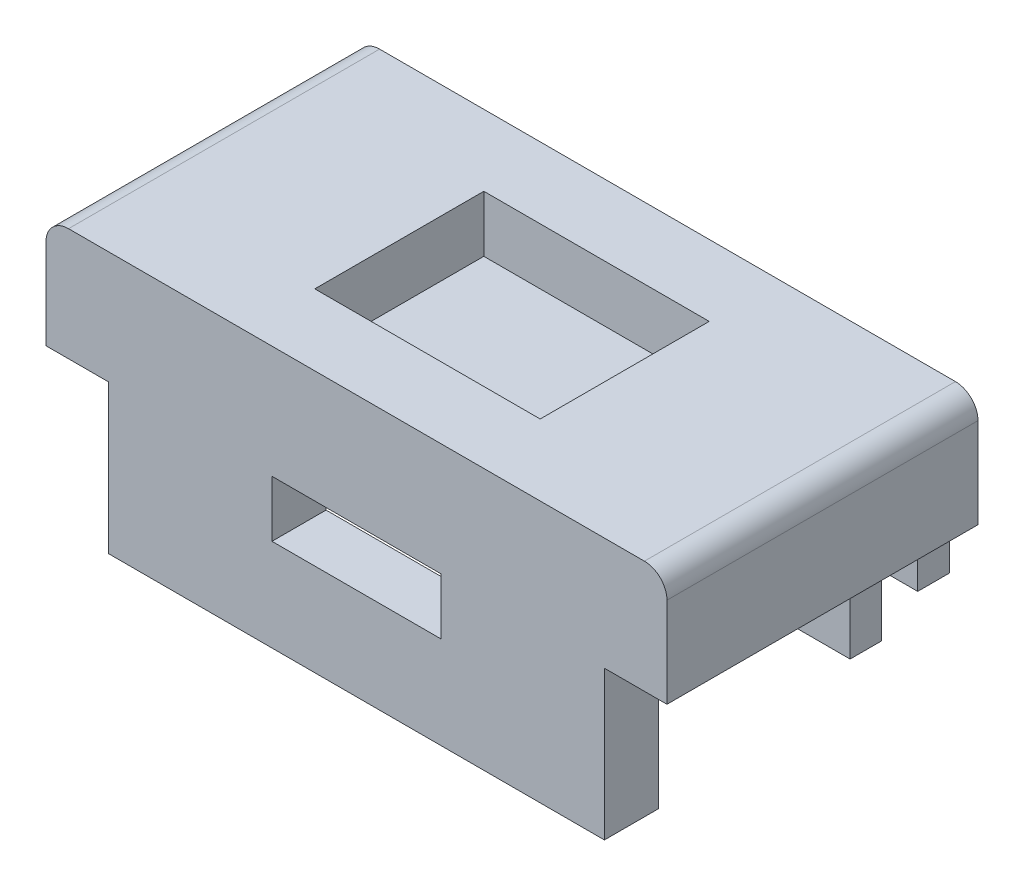
ISO-10303-21;
HEADER;
FILE_DESCRIPTION(('STEP AP214'),'2;1');
FILE_NAME('part.step','',(''),(''),'','','');
FILE_SCHEMA(('AUTOMOTIVE_DESIGN { 1 0 10303 214 1 1 1 1 }'));
ENDSEC;
DATA;
#1=APPLICATION_CONTEXT('core data for automotive mechanical design processes');
#2=APPLICATION_PROTOCOL_DEFINITION('international standard','automotive_design',2000,#1);
#3=PRODUCT_CONTEXT('',#1,'mechanical');
#4=PRODUCT('Part','Part','',(#3));
#5=PRODUCT_RELATED_PRODUCT_CATEGORY('part','',(#4));
#6=PRODUCT_DEFINITION_FORMATION('','',#4);
#7=PRODUCT_DEFINITION_CONTEXT('part definition',#1,'design');
#8=PRODUCT_DEFINITION('design','',#6,#7);
#9=PRODUCT_DEFINITION_SHAPE('','',#8);
#10=(LENGTH_UNIT() NAMED_UNIT(*) SI_UNIT(.MILLI.,.METRE.));
#11=(NAMED_UNIT(*) PLANE_ANGLE_UNIT() SI_UNIT($,.RADIAN.));
#12=(NAMED_UNIT(*) SI_UNIT($,.STERADIAN.) SOLID_ANGLE_UNIT());
#13=UNCERTAINTY_MEASURE_WITH_UNIT(LENGTH_MEASURE(1.E-05),#10,'distance_accuracy_value','');
#14=(GEOMETRIC_REPRESENTATION_CONTEXT(3) GLOBAL_UNCERTAINTY_ASSIGNED_CONTEXT((#13)) GLOBAL_UNIT_ASSIGNED_CONTEXT((#10,
#11,#12)) REPRESENTATION_CONTEXT('',''));
#15=CARTESIAN_POINT('',(0.,0.,0.));
#16=DIRECTION('',(0.,0.,1.));
#17=DIRECTION('',(1.,0.,0.));
#18=AXIS2_PLACEMENT_3D('',#15,#16,#17);
#19=CARTESIAN_POINT('',(0.,-3.81,0.));
#20=DIRECTION('',(0.,1.,0.));
#21=DIRECTION('',(1.,0.,0.));
#22=AXIS2_PLACEMENT_3D('',#19,#20,#21);
#23=PLANE('',#22);
#24=DIRECTION('',(0.,0.,-1.));
#25=VECTOR('',#24,1.);
#26=CARTESIAN_POINT('',(6.35,-3.81,-7.62));
#27=LINE('',#26,#25);
#28=CARTESIAN_POINT('',(6.35,-3.81,-2.794));
#29=VERTEX_POINT('',#28);
#30=CARTESIAN_POINT('',(6.35,-3.81,-3.5052));
#31=VERTEX_POINT('',#30);
#32=EDGE_CURVE('E172',#29,#31,#27,.T.);
#33=ORIENTED_EDGE('',*,*,#32,.F.);
#34=DIRECTION('',(-1.,0.,0.));
#35=VECTOR('',#34,1.);
#36=CARTESIAN_POINT('',(12.7,-3.81,-2.794));
#37=LINE('',#36,#35);
#38=CARTESIAN_POINT('',(4.826,-3.81,-2.794));
#39=VERTEX_POINT('',#38);
#40=EDGE_CURVE('E340',#29,#39,#37,.T.);
#41=ORIENTED_EDGE('',*,*,#40,.T.);
#42=DIRECTION('',(0.,0.,1.));
#43=VECTOR('',#42,1.);
#44=CARTESIAN_POINT('',(4.826,-3.81,-3.81));
#45=LINE('',#44,#43);
#46=CARTESIAN_POINT('',(4.826,-3.81,-3.5052));
#47=VERTEX_POINT('',#46);
#48=EDGE_CURVE('E26',#47,#39,#45,.T.);
#49=ORIENTED_EDGE('',*,*,#48,.F.);
#50=DIRECTION('',(-1.,0.,0.));
#51=VECTOR('',#50,1.);
#52=CARTESIAN_POINT('',(-6.4897,-3.81,-3.5052));
#53=LINE('',#52,#51);
#54=EDGE_CURVE('E363',#31,#47,#53,.T.);
#55=ORIENTED_EDGE('',*,*,#54,.F.);
#56=EDGE_LOOP('',(#33,#41,#49,#55));
#57=FACE_BOUND('',#56,.T.);
#58=ADVANCED_FACE('F16',(#57),#23,.F.);
#59=CARTESIAN_POINT('',(0.,-3.81,0.));
#60=DIRECTION('',(0.,1.,0.));
#61=DIRECTION('',(1.,0.,0.));
#62=AXIS2_PLACEMENT_3D('',#59,#60,#61);
#63=PLANE('',#62);
#64=DIRECTION('',(0.,0.,-1.));
#65=VECTOR('',#64,1.);
#66=CARTESIAN_POINT('',(-4.826,-3.81,-0.762));
#67=LINE('',#66,#65);
#68=CARTESIAN_POINT('',(-4.826,-3.81,-2.794));
#69=VERTEX_POINT('',#68);
#70=CARTESIAN_POINT('',(-4.826,-3.81,-3.5052));
#71=VERTEX_POINT('',#70);
#72=EDGE_CURVE('E11',#69,#71,#67,.T.);
#73=ORIENTED_EDGE('',*,*,#72,.F.);
#74=DIRECTION('',(-1.,0.,0.));
#75=VECTOR('',#74,1.);
#76=CARTESIAN_POINT('',(12.7,-3.81,-2.794));
#77=LINE('',#76,#75);
#78=CARTESIAN_POINT('',(-6.35,-3.81,-2.794));
#79=VERTEX_POINT('',#78);
#80=EDGE_CURVE('E321',#69,#79,#77,.T.);
#81=ORIENTED_EDGE('',*,*,#80,.T.);
#82=DIRECTION('',(0.,0.,1.));
#83=VECTOR('',#82,1.);
#84=CARTESIAN_POINT('',(-6.35,-3.81,-1.27));
#85=LINE('',#84,#83);
#86=CARTESIAN_POINT('',(-6.35,-3.81,-3.5052));
#87=VERTEX_POINT('',#86);
#88=EDGE_CURVE('E373',#87,#79,#85,.T.);
#89=ORIENTED_EDGE('',*,*,#88,.F.);
#90=DIRECTION('',(-1.,0.,0.));
#91=VECTOR('',#90,1.);
#92=CARTESIAN_POINT('',(-6.4897,-3.81,-3.5052));
#93=LINE('',#92,#91);
#94=EDGE_CURVE('E342',#71,#87,#93,.T.);
#95=ORIENTED_EDGE('',*,*,#94,.F.);
#96=EDGE_LOOP('',(#73,#81,#89,#95));
#97=FACE_BOUND('',#96,.T.);
#98=ADVANCED_FACE('F743',(#97),#63,.F.);
#99=CARTESIAN_POINT('',(-4.826,-16.51,-0.762));
#100=DIRECTION('',(1.,0.,0.));
#101=DIRECTION('',(0.,1.,0.));
#102=AXIS2_PLACEMENT_3D('',#99,#100,#101);
#103=PLANE('',#102);
#104=DIRECTION('',(0.,0.,-1.));
#105=VECTOR('',#104,1.);
#106=CARTESIAN_POINT('',(-4.826,-5.8928,3.5052));
#107=LINE('',#106,#105);
#108=CARTESIAN_POINT('',(-4.826,-5.8928,-2.794));
#109=VERTEX_POINT('',#108);
#110=CARTESIAN_POINT('',(-4.826,-5.8928,-3.5052));
#111=VERTEX_POINT('',#110);
#112=EDGE_CURVE('E437',#109,#111,#107,.T.);
#113=ORIENTED_EDGE('',*,*,#112,.F.);
#114=DIRECTION('',(0.,1.,0.));
#115=VECTOR('',#114,1.);
#116=CARTESIAN_POINT('',(-4.826,-8.4328,-2.794));
#117=LINE('',#116,#115);
#118=EDGE_CURVE('E325',#109,#69,#117,.T.);
#119=ORIENTED_EDGE('',*,*,#118,.T.);
#120=ORIENTED_EDGE('',*,*,#72,.T.);
#121=DIRECTION('',(0.,1.,0.));
#122=VECTOR('',#121,1.);
#123=CARTESIAN_POINT('',(-4.826,-0.508,-3.5052));
#124=LINE('',#123,#122);
#125=EDGE_CURVE('E347',#111,#71,#124,.T.);
#126=ORIENTED_EDGE('',*,*,#125,.F.);
#127=EDGE_LOOP('',(#113,#119,#120,#126));
#128=FACE_BOUND('',#127,.T.);
#129=ADVANCED_FACE('F748',(#128),#103,.F.);
#130=CARTESIAN_POINT('',(4.826,-16.51,-3.81));
#131=DIRECTION('',(-1.,0.,0.));
#132=DIRECTION('',(0.,0.,1.));
#133=AXIS2_PLACEMENT_3D('',#130,#131,#132);
#134=PLANE('',#133);
#135=ORIENTED_EDGE('',*,*,#48,.T.);
#136=DIRECTION('',(0.,-1.,0.));
#137=VECTOR('',#136,1.);
#138=CARTESIAN_POINT('',(4.826,-8.4328,-2.794));
#139=LINE('',#138,#137);
#140=CARTESIAN_POINT('',(4.826,-5.8928,-2.794));
#141=VERTEX_POINT('',#140);
#142=EDGE_CURVE('E336',#39,#141,#139,.T.);
#143=ORIENTED_EDGE('',*,*,#142,.T.);
#144=DIRECTION('',(0.,0.,1.));
#145=VECTOR('',#144,1.);
#146=CARTESIAN_POINT('',(4.826,-5.8928,3.5052));
#147=LINE('',#146,#145);
#148=CARTESIAN_POINT('',(4.826,-5.8928,-3.5052));
#149=VERTEX_POINT('',#148);
#150=EDGE_CURVE('E312',#149,#141,#147,.T.);
#151=ORIENTED_EDGE('',*,*,#150,.F.);
#152=DIRECTION('',(0.,-1.,0.));
#153=VECTOR('',#152,1.);
#154=CARTESIAN_POINT('',(4.826,-0.508,-3.5052));
#155=LINE('',#154,#153);
#156=EDGE_CURVE('E367',#47,#149,#155,.T.);
#157=ORIENTED_EDGE('',*,*,#156,.F.);
#158=EDGE_LOOP('',(#135,#143,#151,#157));
#159=FACE_BOUND('',#158,.T.);
#160=ADVANCED_FACE('F711',(#159),#134,.F.);
#161=CARTESIAN_POINT('',(2.54,0.,0.));
#162=DIRECTION('',(1.,0.,0.));
#163=DIRECTION('',(0.,1.,0.));
#164=AXIS2_PLACEMENT_3D('',#161,#162,#163);
#165=PLANE('',#164);
#166=DIRECTION('',(0.,-1.,0.));
#167=VECTOR('',#166,1.);
#168=CARTESIAN_POINT('',(2.54,0.,1.905));
#169=LINE('',#168,#167);
#170=CARTESIAN_POINT('',(2.54,0.,1.905));
#171=VERTEX_POINT('',#170);
#172=CARTESIAN_POINT('',(2.54,-1.27,1.905));
#173=VERTEX_POINT('',#172);
#174=EDGE_CURVE('E372',#171,#173,#169,.T.);
#175=ORIENTED_EDGE('',*,*,#174,.F.);
#176=DIRECTION('',(0.,0.,1.));
#177=VECTOR('',#176,1.);
#178=CARTESIAN_POINT('',(2.54,0.,-1.905));
#179=LINE('',#178,#177);
#180=CARTESIAN_POINT('',(2.54,0.,-1.905));
#181=VERTEX_POINT('',#180);
#182=EDGE_CURVE('E276',#181,#171,#179,.T.);
#183=ORIENTED_EDGE('',*,*,#182,.F.);
#184=DIRECTION('',(0.,1.,0.));
#185=VECTOR('',#184,1.);
#186=CARTESIAN_POINT('',(2.54,-1.27,-1.905));
#187=LINE('',#186,#185);
#188=CARTESIAN_POINT('',(2.54,-1.27,-1.905));
#189=VERTEX_POINT('',#188);
#190=EDGE_CURVE('E39',#189,#181,#187,.T.);
#191=ORIENTED_EDGE('',*,*,#190,.F.);
#192=DIRECTION('',(0.,0.,-1.));
#193=VECTOR('',#192,1.);
#194=CARTESIAN_POINT('',(2.54,-1.27,1.905));
#195=LINE('',#194,#193);
#196=EDGE_CURVE('E390',#173,#189,#195,.T.);
#197=ORIENTED_EDGE('',*,*,#196,.F.);
#198=EDGE_LOOP('',(#175,#183,#191,#197));
#199=FACE_BOUND('',#198,.T.);
#200=ADVANCED_FACE('F754',(#199),#165,.F.);
#201=CARTESIAN_POINT('',(-2.54,0.,0.));
#202=DIRECTION('',(1.,0.,0.));
#203=DIRECTION('',(0.,1.,0.));
#204=AXIS2_PLACEMENT_3D('',#201,#202,#203);
#205=PLANE('',#204);
#206=DIRECTION('',(0.,-1.,0.));
#207=VECTOR('',#206,1.);
#208=CARTESIAN_POINT('',(-2.54,0.,1.905));
#209=LINE('',#208,#207);
#210=CARTESIAN_POINT('',(-2.54,0.,1.905));
#211=VERTEX_POINT('',#210);
#212=CARTESIAN_POINT('',(-2.54,-1.27,1.905));
#213=VERTEX_POINT('',#212);
#214=EDGE_CURVE('E369',#211,#213,#209,.T.);
#215=ORIENTED_EDGE('',*,*,#214,.T.);
#216=DIRECTION('',(0.,0.,-1.));
#217=VECTOR('',#216,1.);
#218=CARTESIAN_POINT('',(-2.54,-1.27,1.905));
#219=LINE('',#218,#217);
#220=CARTESIAN_POINT('',(-2.54,-1.27,-1.905));
#221=VERTEX_POINT('',#220);
#222=EDGE_CURVE('E257',#213,#221,#219,.T.);
#223=ORIENTED_EDGE('',*,*,#222,.T.);
#224=DIRECTION('',(0.,1.,0.));
#225=VECTOR('',#224,1.);
#226=CARTESIAN_POINT('',(-2.54,-1.27,-1.905));
#227=LINE('',#226,#225);
#228=CARTESIAN_POINT('',(-2.54,0.,-1.905));
#229=VERTEX_POINT('',#228);
#230=EDGE_CURVE('E251',#221,#229,#227,.T.);
#231=ORIENTED_EDGE('',*,*,#230,.T.);
#232=DIRECTION('',(0.,0.,1.));
#233=VECTOR('',#232,1.);
#234=CARTESIAN_POINT('',(-2.54,0.,-1.905));
#235=LINE('',#234,#233);
#236=EDGE_CURVE('E255',#229,#211,#235,.T.);
#237=ORIENTED_EDGE('',*,*,#236,.T.);
#238=EDGE_LOOP('',(#215,#223,#231,#237));
#239=FACE_BOUND('',#238,.T.);
#240=ADVANCED_FACE('F254',(#239),#205,.T.);
#241=CARTESIAN_POINT('',(2.54,-1.27,-1.905));
#242=DIRECTION('',(0.,0.,1.));
#243=DIRECTION('',(1.,0.,0.));
#244=AXIS2_PLACEMENT_3D('',#241,#242,#243);
#245=PLANE('',#244);
#246=ORIENTED_EDGE('',*,*,#230,.F.);
#247=DIRECTION('',(-1.,0.,0.));
#248=VECTOR('',#247,1.);
#249=CARTESIAN_POINT('',(2.54,-1.27,-1.905));
#250=LINE('',#249,#248);
#251=EDGE_CURVE('E262',#189,#221,#250,.T.);
#252=ORIENTED_EDGE('',*,*,#251,.F.);
#253=ORIENTED_EDGE('',*,*,#190,.T.);
#254=DIRECTION('',(-1.,0.,0.));
#255=VECTOR('',#254,1.);
#256=CARTESIAN_POINT('',(2.54,0.,-1.905));
#257=LINE('',#256,#255);
#258=EDGE_CURVE('E268',#181,#229,#257,.T.);
#259=ORIENTED_EDGE('',*,*,#258,.T.);
#260=EDGE_LOOP('',(#246,#252,#253,#259));
#261=FACE_BOUND('',#260,.T.);
#262=ADVANCED_FACE('F274',(#261),#245,.T.);
#263=CARTESIAN_POINT('',(2.54,-1.27,1.905));
#264=DIRECTION('',(0.,1.,0.));
#265=DIRECTION('',(1.,0.,0.));
#266=AXIS2_PLACEMENT_3D('',#263,#264,#265);
#267=PLANE('',#266);
#268=ORIENTED_EDGE('',*,*,#222,.F.);
#269=DIRECTION('',(-1.,0.,0.));
#270=VECTOR('',#269,1.);
#271=CARTESIAN_POINT('',(2.54,-1.27,1.905));
#272=LINE('',#271,#270);
#273=EDGE_CURVE('E387',#173,#213,#272,.T.);
#274=ORIENTED_EDGE('',*,*,#273,.F.);
#275=ORIENTED_EDGE('',*,*,#196,.T.);
#276=ORIENTED_EDGE('',*,*,#251,.T.);
#277=EDGE_LOOP('',(#268,#274,#275,#276));
#278=FACE_BOUND('',#277,.T.);
#279=ADVANCED_FACE('F766',(#278),#267,.T.);
#280=CARTESIAN_POINT('',(2.54,0.,1.905));
#281=DIRECTION('',(0.,0.,-1.));
#282=DIRECTION('',(0.,-1.,0.));
#283=AXIS2_PLACEMENT_3D('',#280,#281,#282);
#284=PLANE('',#283);
#285=ORIENTED_EDGE('',*,*,#214,.F.);
#286=DIRECTION('',(-1.,0.,0.));
#287=VECTOR('',#286,1.);
#288=CARTESIAN_POINT('',(2.54,0.,1.905));
#289=LINE('',#288,#287);
#290=EDGE_CURVE('E270',#171,#211,#289,.T.);
#291=ORIENTED_EDGE('',*,*,#290,.F.);
#292=ORIENTED_EDGE('',*,*,#174,.T.);
#293=ORIENTED_EDGE('',*,*,#273,.T.);
#294=EDGE_LOOP('',(#285,#291,#292,#293));
#295=FACE_BOUND('',#294,.T.);
#296=ADVANCED_FACE('F760',(#295),#284,.T.);
#297=CARTESIAN_POINT('',(-6.35,-5.08,-1.27));
#298=DIRECTION('',(1.,0.,0.));
#299=DIRECTION('',(0.,1.,0.));
#300=AXIS2_PLACEMENT_3D('',#297,#298,#299);
#301=PLANE('',#300);
#302=DIRECTION('',(0.,1.,0.));
#303=VECTOR('',#302,1.);
#304=CARTESIAN_POINT('',(-6.35,-0.508,-3.5052));
#305=LINE('',#304,#303);
#306=CARTESIAN_POINT('',(-6.35,-2.54,-3.5052));
#307=VERTEX_POINT('',#306);
#308=EDGE_CURVE('E346',#87,#307,#305,.T.);
#309=ORIENTED_EDGE('',*,*,#308,.F.);
#310=ORIENTED_EDGE('',*,*,#88,.T.);
#311=DIRECTION('',(0.,1.,0.));
#312=VECTOR('',#311,1.);
#313=CARTESIAN_POINT('',(-6.35,-8.4328,-2.794));
#314=LINE('',#313,#312);
#315=CARTESIAN_POINT('',(-6.35,-2.54,-2.794));
#316=VERTEX_POINT('',#315);
#317=EDGE_CURVE('E326',#79,#316,#314,.T.);
#318=ORIENTED_EDGE('',*,*,#317,.T.);
#319=DIRECTION('',(0.,0.,-1.));
#320=VECTOR('',#319,1.);
#321=CARTESIAN_POINT('',(-6.35,-2.54,-1.27));
#322=LINE('',#321,#320);
#323=EDGE_CURVE('E431',#316,#307,#322,.T.);
#324=ORIENTED_EDGE('',*,*,#323,.T.);
#325=EDGE_LOOP('',(#309,#310,#318,#324));
#326=FACE_BOUND('',#325,.T.);
#327=ADVANCED_FACE('F757',(#326),#301,.F.);
#328=CARTESIAN_POINT('',(6.35,-5.08,-7.62));
#329=DIRECTION('',(-1.,0.,0.));
#330=DIRECTION('',(0.,0.,1.));
#331=AXIS2_PLACEMENT_3D('',#328,#329,#330);
#332=PLANE('',#331);
#333=DIRECTION('',(0.,-1.,0.));
#334=VECTOR('',#333,1.);
#335=CARTESIAN_POINT('',(6.35,-8.4328,-2.794));
#336=LINE('',#335,#334);
#337=CARTESIAN_POINT('',(6.35,-2.54,-2.794));
#338=VERTEX_POINT('',#337);
#339=EDGE_CURVE('E444',#338,#29,#336,.T.);
#340=ORIENTED_EDGE('',*,*,#339,.T.);
#341=ORIENTED_EDGE('',*,*,#32,.T.);
#342=DIRECTION('',(0.,-1.,0.));
#343=VECTOR('',#342,1.);
#344=CARTESIAN_POINT('',(6.35,-0.508,-3.5052));
#345=LINE('',#344,#343);
#346=CARTESIAN_POINT('',(6.35,-2.54,-3.5052));
#347=VERTEX_POINT('',#346);
#348=EDGE_CURVE('E407',#347,#31,#345,.T.);
#349=ORIENTED_EDGE('',*,*,#348,.F.);
#350=DIRECTION('',(0.,0.,1.));
#351=VECTOR('',#350,1.);
#352=CARTESIAN_POINT('',(6.35,-2.54,-7.62));
#353=LINE('',#352,#351);
#354=EDGE_CURVE('E294',#347,#338,#353,.T.);
#355=ORIENTED_EDGE('',*,*,#354,.T.);
#356=EDGE_LOOP('',(#340,#341,#349,#355));
#357=FACE_BOUND('',#356,.T.);
#358=ADVANCED_FACE('F728',(#357),#332,.F.);
#359=CARTESIAN_POINT('',(5.588,-15.24,2.286));
#360=DIRECTION('',(-1.,0.,0.));
#361=DIRECTION('',(0.,0.,1.));
#362=AXIS2_PLACEMENT_3D('',#359,#360,#361);
#363=PLANE('',#362);
#364=DIRECTION('',(0.,1.,0.));
#365=VECTOR('',#364,1.);
#366=CARTESIAN_POINT('',(5.588,-15.24,2.286));
#367=LINE('',#366,#365);
#368=CARTESIAN_POINT('',(5.588,-5.8928,2.286));
#369=VERTEX_POINT('',#368);
#370=CARTESIAN_POINT('',(5.588,-2.54,2.286));
#371=VERTEX_POINT('',#370);
#372=EDGE_CURVE('E341',#369,#371,#367,.T.);
#373=ORIENTED_EDGE('',*,*,#372,.T.);
#374=DIRECTION('',(0.,0.,1.));
#375=VECTOR('',#374,1.);
#376=CARTESIAN_POINT('',(5.588,-2.54,2.286));
#377=LINE('',#376,#375);
#378=CARTESIAN_POINT('',(5.588,-2.54,3.5052));
#379=VERTEX_POINT('',#378);
#380=EDGE_CURVE('E291',#371,#379,#377,.T.);
#381=ORIENTED_EDGE('',*,*,#380,.T.);
#382=DIRECTION('',(0.,-1.,0.));
#383=VECTOR('',#382,1.);
#384=CARTESIAN_POINT('',(5.588,-0.508,3.5052));
#385=LINE('',#384,#383);
#386=CARTESIAN_POINT('',(5.588,-5.8928,3.5052));
#387=VERTEX_POINT('',#386);
#388=EDGE_CURVE('E415',#379,#387,#385,.T.);
#389=ORIENTED_EDGE('',*,*,#388,.T.);
#390=DIRECTION('',(0.,0.,1.));
#391=VECTOR('',#390,1.);
#392=CARTESIAN_POINT('',(5.588,-5.8928,3.5052));
#393=LINE('',#392,#391);
#394=EDGE_CURVE('E317',#369,#387,#393,.T.);
#395=ORIENTED_EDGE('',*,*,#394,.F.);
#396=EDGE_LOOP('',(#373,#381,#389,#395));
#397=FACE_BOUND('',#396,.T.);
#398=ADVANCED_FACE('F616',(#397),#363,.F.);
#399=CARTESIAN_POINT('',(-5.588,-15.24,12.7));
#400=DIRECTION('',(1.,0.,0.));
#401=DIRECTION('',(0.,1.,0.));
#402=AXIS2_PLACEMENT_3D('',#399,#400,#401);
#403=PLANE('',#402);
#404=DIRECTION('',(0.,1.,0.));
#405=VECTOR('',#404,1.);
#406=CARTESIAN_POINT('',(-5.588,-0.508,3.5052));
#407=LINE('',#406,#405);
#408=CARTESIAN_POINT('',(-5.588,-5.8928,3.5052));
#409=VERTEX_POINT('',#408);
#410=CARTESIAN_POINT('',(-5.588,-2.54,3.5052));
#411=VERTEX_POINT('',#410);
#412=EDGE_CURVE('E287',#409,#411,#407,.T.);
#413=ORIENTED_EDGE('',*,*,#412,.T.);
#414=DIRECTION('',(0.,0.,-1.));
#415=VECTOR('',#414,1.);
#416=CARTESIAN_POINT('',(-5.588,-2.54,12.7));
#417=LINE('',#416,#415);
#418=CARTESIAN_POINT('',(-5.588,-2.54,2.286));
#419=VERTEX_POINT('',#418);
#420=EDGE_CURVE('E144',#411,#419,#417,.T.);
#421=ORIENTED_EDGE('',*,*,#420,.T.);
#422=DIRECTION('',(0.,1.,0.));
#423=VECTOR('',#422,1.);
#424=CARTESIAN_POINT('',(-5.588,-15.24,2.286));
#425=LINE('',#424,#423);
#426=CARTESIAN_POINT('',(-5.588,-5.8928,2.286));
#427=VERTEX_POINT('',#426);
#428=EDGE_CURVE('E440',#427,#419,#425,.T.);
#429=ORIENTED_EDGE('',*,*,#428,.F.);
#430=DIRECTION('',(0.,0.,-1.));
#431=VECTOR('',#430,1.);
#432=CARTESIAN_POINT('',(-5.588,-5.8928,3.5052));
#433=LINE('',#432,#431);
#434=EDGE_CURVE('E331',#409,#427,#433,.T.);
#435=ORIENTED_EDGE('',*,*,#434,.F.);
#436=EDGE_LOOP('',(#413,#421,#429,#435));
#437=FACE_BOUND('',#436,.T.);
#438=ADVANCED_FACE('F605',(#437),#403,.F.);
#439=CARTESIAN_POINT('',(1.905,0.,0.));
#440=DIRECTION('',(1.,0.,0.));
#441=DIRECTION('',(0.,1.,0.));
#442=AXIS2_PLACEMENT_3D('',#439,#440,#441);
#443=PLANE('',#442);
#444=DIRECTION('',(0.,1.,0.));
#445=VECTOR('',#444,1.);
#446=CARTESIAN_POINT('',(1.905,-0.508,3.5052));
#447=LINE('',#446,#445);
#448=CARTESIAN_POINT('',(1.905,-3.81,3.5052));
#449=VERTEX_POINT('',#448);
#450=CARTESIAN_POINT('',(1.905,-2.54,3.5052));
#451=VERTEX_POINT('',#450);
#452=EDGE_CURVE('E289',#449,#451,#447,.T.);
#453=ORIENTED_EDGE('',*,*,#452,.T.);
#454=DIRECTION('',(0.,0.,1.));
#455=VECTOR('',#454,1.);
#456=CARTESIAN_POINT('',(1.905,-2.54,-6.35));
#457=LINE('',#456,#455);
#458=CARTESIAN_POINT('',(1.905,-2.54,2.286));
#459=VERTEX_POINT('',#458);
#460=EDGE_CURVE('E157',#459,#451,#457,.T.);
#461=ORIENTED_EDGE('',*,*,#460,.F.);
#462=DIRECTION('',(0.,-1.,0.));
#463=VECTOR('',#462,1.);
#464=CARTESIAN_POINT('',(1.905,-2.54,2.286));
#465=LINE('',#464,#463);
#466=CARTESIAN_POINT('',(1.905,-3.81,2.286));
#467=VERTEX_POINT('',#466);
#468=EDGE_CURVE('E383',#459,#467,#465,.T.);
#469=ORIENTED_EDGE('',*,*,#468,.T.);
#470=DIRECTION('',(0.,0.,-1.));
#471=VECTOR('',#470,1.);
#472=CARTESIAN_POINT('',(1.905,-3.81,6.35));
#473=LINE('',#472,#471);
#474=EDGE_CURVE('E397',#449,#467,#473,.T.);
#475=ORIENTED_EDGE('',*,*,#474,.F.);
#476=EDGE_LOOP('',(#453,#461,#469,#475));
#477=FACE_BOUND('',#476,.T.);
#478=ADVANCED_FACE('F815',(#477),#443,.F.);
#479=CARTESIAN_POINT('',(1.905,-3.81,6.35));
#480=DIRECTION('',(0.,1.,0.));
#481=DIRECTION('',(1.,0.,0.));
#482=AXIS2_PLACEMENT_3D('',#479,#480,#481);
#483=PLANE('',#482);
#484=ORIENTED_EDGE('',*,*,#474,.T.);
#485=DIRECTION('',(1.,0.,0.));
#486=VECTOR('',#485,1.);
#487=CARTESIAN_POINT('',(12.7,-3.81,2.286));
#488=LINE('',#487,#486);
#489=CARTESIAN_POINT('',(-1.905,-3.81,2.286));
#490=VERTEX_POINT('',#489);
#491=EDGE_CURVE('E379',#490,#467,#488,.T.);
#492=ORIENTED_EDGE('',*,*,#491,.F.);
#493=DIRECTION('',(0.,0.,-1.));
#494=VECTOR('',#493,1.);
#495=CARTESIAN_POINT('',(-1.905,-3.81,6.35));
#496=LINE('',#495,#494);
#497=CARTESIAN_POINT('',(-1.905,-3.81,3.5052));
#498=VERTEX_POINT('',#497);
#499=EDGE_CURVE('E306',#498,#490,#496,.T.);
#500=ORIENTED_EDGE('',*,*,#499,.F.);
#501=DIRECTION('',(-1.,0.,0.));
#502=VECTOR('',#501,1.);
#503=CARTESIAN_POINT('',(-6.4897,-3.81,3.5052));
#504=LINE('',#503,#502);
#505=EDGE_CURVE('E538',#449,#498,#504,.T.);
#506=ORIENTED_EDGE('',*,*,#505,.F.);
#507=EDGE_LOOP('',(#484,#492,#500,#506));
#508=FACE_BOUND('',#507,.T.);
#509=ADVANCED_FACE('F773',(#508),#483,.T.);
#510=CARTESIAN_POINT('',(-6.4897,-0.508,3.5052));
#511=DIRECTION('',(0.,0.,1.));
#512=DIRECTION('',(-1.,0.,0.));
#513=AXIS2_PLACEMENT_3D('',#510,#511,#512);
#514=CYLINDRICAL_SURFACE('',#513,0.508);
#515=CARTESIAN_POINT('',(-6.4897,-0.508,-3.5052));
#516=DIRECTION('',(0.,0.,1.));
#517=DIRECTION('',(1.,0.,0.));
#518=AXIS2_PLACEMENT_3D('',#515,#516,#517);
#519=CIRCLE('',#518,0.508);
#520=CARTESIAN_POINT('',(-6.4897,0.,-3.5052));
#521=VERTEX_POINT('',#520);
#522=CARTESIAN_POINT('',(-6.9977,-0.508,-3.5052));
#523=VERTEX_POINT('',#522);
#524=EDGE_CURVE('E425',#521,#523,#519,.T.);
#525=ORIENTED_EDGE('',*,*,#524,.T.);
#526=DIRECTION('',(0.,0.,-1.));
#527=VECTOR('',#526,1.);
#528=CARTESIAN_POINT('',(-6.9977,-0.508,3.5052));
#529=LINE('',#528,#527);
#530=CARTESIAN_POINT('',(-6.9977,-0.508,3.5052));
#531=VERTEX_POINT('',#530);
#532=EDGE_CURVE('E277',#531,#523,#529,.T.);
#533=ORIENTED_EDGE('',*,*,#532,.F.);
#534=CARTESIAN_POINT('',(-6.4897,-0.508,3.5052));
#535=DIRECTION('',(0.,0.,1.));
#536=DIRECTION('',(1.,0.,0.));
#537=AXIS2_PLACEMENT_3D('',#534,#535,#536);
#538=CIRCLE('',#537,0.508);
#539=CARTESIAN_POINT('',(-6.4897,0.,3.5052));
#540=VERTEX_POINT('',#539);
#541=EDGE_CURVE('E414',#540,#531,#538,.T.);
#542=ORIENTED_EDGE('',*,*,#541,.F.);
#543=DIRECTION('',(0.,0.,-1.));
#544=VECTOR('',#543,1.);
#545=CARTESIAN_POINT('',(-6.4897,0.,3.5052));
#546=LINE('',#545,#544);
#547=EDGE_CURVE('E272',#540,#521,#546,.T.);
#548=ORIENTED_EDGE('',*,*,#547,.T.);
#549=EDGE_LOOP('',(#525,#533,#542,#548));
#550=FACE_BOUND('',#549,.T.);
#551=ADVANCED_FACE('F593',(#550),#514,.T.);
#552=CARTESIAN_POINT('',(12.7,-2.54,-2.794));
#553=DIRECTION('',(0.,-1.,0.));
#554=DIRECTION('',(0.,0.,-1.));
#555=AXIS2_PLACEMENT_3D('',#552,#553,#554);
#556=PLANE('',#555);
#557=DIRECTION('',(-1.,0.,0.));
#558=VECTOR('',#557,1.);
#559=CARTESIAN_POINT('',(12.7,-2.54,-2.794));
#560=LINE('',#559,#558);
#561=CARTESIAN_POINT('',(1.905,-2.54,-2.794));
#562=VERTEX_POINT('',#561);
#563=EDGE_CURVE('E447',#338,#562,#560,.T.);
#564=ORIENTED_EDGE('',*,*,#563,.F.);
#565=ORIENTED_EDGE('',*,*,#354,.F.);
#566=DIRECTION('',(-1.,0.,0.));
#567=VECTOR('',#566,1.);
#568=CARTESIAN_POINT('',(-6.4897,-2.54,-3.5052));
#569=LINE('',#568,#567);
#570=CARTESIAN_POINT('',(6.9977,-2.54,-3.5052));
#571=VERTEX_POINT('',#570);
#572=EDGE_CURVE('E403',#571,#347,#569,.T.);
#573=ORIENTED_EDGE('',*,*,#572,.F.);
#574=DIRECTION('',(0.,0.,1.));
#575=VECTOR('',#574,1.);
#576=CARTESIAN_POINT('',(6.9977,-2.54,3.5052));
#577=LINE('',#576,#575);
#578=CARTESIAN_POINT('',(6.9977,-2.54,3.5052));
#579=VERTEX_POINT('',#578);
#580=EDGE_CURVE('E352',#571,#579,#577,.T.);
#581=ORIENTED_EDGE('',*,*,#580,.T.);
#582=DIRECTION('',(-1.,0.,0.));
#583=VECTOR('',#582,1.);
#584=CARTESIAN_POINT('',(-6.4897,-2.54,3.5052));
#585=LINE('',#584,#583);
#586=EDGE_CURVE('E411',#579,#379,#585,.T.);
#587=ORIENTED_EDGE('',*,*,#586,.T.);
#588=ORIENTED_EDGE('',*,*,#380,.F.);
#589=DIRECTION('',(-1.,0.,0.));
#590=VECTOR('',#589,1.);
#591=CARTESIAN_POINT('',(12.7,-2.54,2.286));
#592=LINE('',#591,#590);
#593=EDGE_CURVE('E419',#371,#459,#592,.T.);
#594=ORIENTED_EDGE('',*,*,#593,.T.);
#595=ORIENTED_EDGE('',*,*,#460,.T.);
#596=DIRECTION('',(1.,0.,0.));
#597=VECTOR('',#596,1.);
#598=CARTESIAN_POINT('',(-6.4897,-2.54,3.5052));
#599=LINE('',#598,#597);
#600=CARTESIAN_POINT('',(-1.905,-2.54,3.5052));
#601=VERTEX_POINT('',#600);
#602=EDGE_CURVE('E179',#601,#451,#599,.T.);
#603=ORIENTED_EDGE('',*,*,#602,.F.);
#604=DIRECTION('',(0.,0.,1.));
#605=VECTOR('',#604,1.);
#606=CARTESIAN_POINT('',(-1.905,-2.54,-6.35));
#607=LINE('',#606,#605);
#608=CARTESIAN_POINT('',(-1.905,-2.54,2.286));
#609=VERTEX_POINT('',#608);
#610=EDGE_CURVE('E320',#609,#601,#607,.T.);
#611=ORIENTED_EDGE('',*,*,#610,.F.);
#612=DIRECTION('',(-1.,0.,0.));
#613=VECTOR('',#612,1.);
#614=CARTESIAN_POINT('',(12.7,-2.54,2.286));
#615=LINE('',#614,#613);
#616=EDGE_CURVE('E190',#609,#419,#615,.T.);
#617=ORIENTED_EDGE('',*,*,#616,.T.);
#618=ORIENTED_EDGE('',*,*,#420,.F.);
#619=DIRECTION('',(-1.,0.,0.));
#620=VECTOR('',#619,1.);
#621=CARTESIAN_POINT('',(-6.4897,-2.54,3.5052));
#622=LINE('',#621,#620);
#623=CARTESIAN_POINT('',(-6.9977,-2.54,3.5052));
#624=VERTEX_POINT('',#623);
#625=EDGE_CURVE('E290',#411,#624,#622,.T.);
#626=ORIENTED_EDGE('',*,*,#625,.T.);
#627=DIRECTION('',(0.,0.,-1.));
#628=VECTOR('',#627,1.);
#629=CARTESIAN_POINT('',(-6.9977,-2.54,3.5052));
#630=LINE('',#629,#628);
#631=CARTESIAN_POINT('',(-6.9977,-2.54,-3.5052));
#632=VERTEX_POINT('',#631);
#633=EDGE_CURVE('E394',#624,#632,#630,.T.);
#634=ORIENTED_EDGE('',*,*,#633,.T.);
#635=DIRECTION('',(-1.,0.,0.));
#636=VECTOR('',#635,1.);
#637=CARTESIAN_POINT('',(-6.4897,-2.54,-3.5052));
#638=LINE('',#637,#636);
#639=EDGE_CURVE('E374',#307,#632,#638,.T.);
#640=ORIENTED_EDGE('',*,*,#639,.F.);
#641=ORIENTED_EDGE('',*,*,#323,.F.);
#642=DIRECTION('',(-1.,0.,0.));
#643=VECTOR('',#642,1.);
#644=CARTESIAN_POINT('',(12.7,-2.54,-2.794));
#645=LINE('',#644,#643);
#646=CARTESIAN_POINT('',(-1.905,-2.54,-2.794));
#647=VERTEX_POINT('',#646);
#648=EDGE_CURVE('E448',#647,#316,#645,.T.);
#649=ORIENTED_EDGE('',*,*,#648,.F.);
#650=DIRECTION('',(0.,0.,1.));
#651=VECTOR('',#650,1.);
#652=CARTESIAN_POINT('',(-1.905,-2.54,-6.35));
#653=LINE('',#652,#651);
#654=CARTESIAN_POINT('',(-1.905,-2.54,-3.5052));
#655=VERTEX_POINT('',#654);
#656=EDGE_CURVE('E299',#655,#647,#653,.T.);
#657=ORIENTED_EDGE('',*,*,#656,.F.);
#658=DIRECTION('',(1.,0.,0.));
#659=VECTOR('',#658,1.);
#660=CARTESIAN_POINT('',(-6.4897,-2.54,-3.5052));
#661=LINE('',#660,#659);
#662=CARTESIAN_POINT('',(1.905,-2.54,-3.5052));
#663=VERTEX_POINT('',#662);
#664=EDGE_CURVE('E368',#655,#663,#661,.T.);
#665=ORIENTED_EDGE('',*,*,#664,.T.);
#666=DIRECTION('',(0.,0.,1.));
#667=VECTOR('',#666,1.);
#668=CARTESIAN_POINT('',(1.905,-2.54,-6.35));
#669=LINE('',#668,#667);
#670=EDGE_CURVE('E335',#663,#562,#669,.T.);
#671=ORIENTED_EDGE('',*,*,#670,.T.);
#672=EDGE_LOOP('',(#564,#565,#573,#581,#587,#588,#594,#595,#603,#611,#617,#618,#626,#634,#640,
#641,#649,#657,#665,#671));
#673=FACE_BOUND('',#672,.T.);
#674=ADVANCED_FACE('F603',(#673),#556,.T.);
#675=CARTESIAN_POINT('',(12.7,-8.4328,-2.794));
#676=DIRECTION('',(0.,0.,1.));
#677=DIRECTION('',(1.,0.,0.));
#678=AXIS2_PLACEMENT_3D('',#675,#676,#677);
#679=PLANE('',#678);
#680=ORIENTED_EDGE('',*,*,#142,.F.);
#681=ORIENTED_EDGE('',*,*,#40,.F.);
#682=ORIENTED_EDGE('',*,*,#339,.F.);
#683=ORIENTED_EDGE('',*,*,#563,.T.);
#684=DIRECTION('',(0.,1.,0.));
#685=VECTOR('',#684,1.);
#686=CARTESIAN_POINT('',(1.905,-8.4328,-2.794));
#687=LINE('',#686,#685);
#688=CARTESIAN_POINT('',(1.905,-3.81,-2.794));
#689=VERTEX_POINT('',#688);
#690=EDGE_CURVE('E304',#689,#562,#687,.T.);
#691=ORIENTED_EDGE('',*,*,#690,.F.);
#692=DIRECTION('',(-1.,0.,0.));
#693=VECTOR('',#692,1.);
#694=CARTESIAN_POINT('',(12.7,-3.81,-2.794));
#695=LINE('',#694,#693);
#696=CARTESIAN_POINT('',(-1.905,-3.81,-2.794));
#697=VERTEX_POINT('',#696);
#698=EDGE_CURVE('E305',#689,#697,#695,.T.);
#699=ORIENTED_EDGE('',*,*,#698,.T.);
#700=DIRECTION('',(0.,1.,0.));
#701=VECTOR('',#700,1.);
#702=CARTESIAN_POINT('',(-1.905,-8.4328,-2.794));
#703=LINE('',#702,#701);
#704=EDGE_CURVE('E358',#697,#647,#703,.T.);
#705=ORIENTED_EDGE('',*,*,#704,.T.);
#706=ORIENTED_EDGE('',*,*,#648,.T.);
#707=ORIENTED_EDGE('',*,*,#317,.F.);
#708=ORIENTED_EDGE('',*,*,#80,.F.);
#709=ORIENTED_EDGE('',*,*,#118,.F.);
#710=DIRECTION('',(1.,0.,0.));
#711=VECTOR('',#710,1.);
#712=CARTESIAN_POINT('',(-6.9977,-5.8928,-2.794));
#713=LINE('',#712,#711);
#714=EDGE_CURVE('E316',#109,#141,#713,.T.);
#715=ORIENTED_EDGE('',*,*,#714,.T.);
#716=EDGE_LOOP('',(#680,#681,#682,#683,#691,#699,#705,#706,#707,#708,#709,#715));
#717=FACE_BOUND('',#716,.T.);
#718=ADVANCED_FACE('F718',(#717),#679,.T.);
#719=CARTESIAN_POINT('',(12.7,-2.54,2.286));
#720=DIRECTION('',(0.,0.,-1.));
#721=DIRECTION('',(0.,-1.,0.));
#722=AXIS2_PLACEMENT_3D('',#719,#720,#721);
#723=PLANE('',#722);
#724=ORIENTED_EDGE('',*,*,#428,.T.);
#725=ORIENTED_EDGE('',*,*,#616,.F.);
#726=DIRECTION('',(0.,-1.,0.));
#727=VECTOR('',#726,1.);
#728=CARTESIAN_POINT('',(-1.905,-2.54,2.286));
#729=LINE('',#728,#727);
#730=EDGE_CURVE('E310',#609,#490,#729,.T.);
#731=ORIENTED_EDGE('',*,*,#730,.T.);
#732=ORIENTED_EDGE('',*,*,#491,.T.);
#733=ORIENTED_EDGE('',*,*,#468,.F.);
#734=ORIENTED_EDGE('',*,*,#593,.F.);
#735=ORIENTED_EDGE('',*,*,#372,.F.);
#736=DIRECTION('',(-1.,0.,0.));
#737=VECTOR('',#736,1.);
#738=CARTESIAN_POINT('',(-6.9977,-5.8928,2.286));
#739=LINE('',#738,#737);
#740=EDGE_CURVE('E327',#369,#427,#739,.T.);
#741=ORIENTED_EDGE('',*,*,#740,.T.);
#742=EDGE_LOOP('',(#724,#725,#731,#732,#733,#734,#735,#741));
#743=FACE_BOUND('',#742,.T.);
#744=ADVANCED_FACE('F850',(#743),#723,.T.);
#745=CARTESIAN_POINT('',(-6.4897,-0.508,3.5052));
#746=DIRECTION('',(0.,0.,1.));
#747=DIRECTION('',(1.,0.,0.));
#748=AXIS2_PLACEMENT_3D('',#745,#746,#747);
#749=PLANE('',#748);
#750=ORIENTED_EDGE('',*,*,#452,.F.);
#751=ORIENTED_EDGE('',*,*,#505,.T.);
#752=DIRECTION('',(0.,1.,0.));
#753=VECTOR('',#752,1.);
#754=CARTESIAN_POINT('',(-1.905,-0.508,3.5052));
#755=LINE('',#754,#753);
#756=EDGE_CURVE('E457',#498,#601,#755,.T.);
#757=ORIENTED_EDGE('',*,*,#756,.T.);
#758=ORIENTED_EDGE('',*,*,#602,.T.);
#759=EDGE_LOOP('',(#750,#751,#757,#758));
#760=FACE_BOUND('',#759,.T.);
#761=ORIENTED_EDGE('',*,*,#388,.F.);
#762=ORIENTED_EDGE('',*,*,#586,.F.);
#763=DIRECTION('',(0.,1.,0.));
#764=VECTOR('',#763,1.);
#765=CARTESIAN_POINT('',(6.9977,-5.8928,3.5052));
#766=LINE('',#765,#764);
#767=CARTESIAN_POINT('',(6.9977,-0.508,3.5052));
#768=VERTEX_POINT('',#767);
#769=EDGE_CURVE('E356',#579,#768,#766,.T.);
#770=ORIENTED_EDGE('',*,*,#769,.T.);
#771=CARTESIAN_POINT('',(6.4897,-0.508,3.5052));
#772=DIRECTION('',(0.,0.,1.));
#773=DIRECTION('',(1.,0.,0.));
#774=AXIS2_PLACEMENT_3D('',#771,#772,#773);
#775=CIRCLE('',#774,0.508);
#776=CARTESIAN_POINT('',(6.4897,0.,3.5052));
#777=VERTEX_POINT('',#776);
#778=EDGE_CURVE('E461',#768,#777,#775,.T.);
#779=ORIENTED_EDGE('',*,*,#778,.T.);
#780=DIRECTION('',(-1.,0.,0.));
#781=VECTOR('',#780,1.);
#782=CARTESIAN_POINT('',(6.4897,0.,3.5052));
#783=LINE('',#782,#781);
#784=EDGE_CURVE('E480',#777,#540,#783,.T.);
#785=ORIENTED_EDGE('',*,*,#784,.T.);
#786=ORIENTED_EDGE('',*,*,#541,.T.);
#787=DIRECTION('',(0.,-1.,0.));
#788=VECTOR('',#787,1.);
#789=CARTESIAN_POINT('',(-6.9977,-0.508,3.5052));
#790=LINE('',#789,#788);
#791=EDGE_CURVE('E284',#531,#624,#790,.T.);
#792=ORIENTED_EDGE('',*,*,#791,.T.);
#793=ORIENTED_EDGE('',*,*,#625,.F.);
#794=ORIENTED_EDGE('',*,*,#412,.F.);
#795=DIRECTION('',(1.,0.,0.));
#796=VECTOR('',#795,1.);
#797=CARTESIAN_POINT('',(-6.9977,-5.8928,3.5052));
#798=LINE('',#797,#796);
#799=EDGE_CURVE('E471',#409,#387,#798,.T.);
#800=ORIENTED_EDGE('',*,*,#799,.T.);
#801=EDGE_LOOP('',(#761,#762,#770,#779,#785,#786,#792,#793,#794,#800));
#802=FACE_BOUND('',#801,.T.);
#803=ADVANCED_FACE('F582',(#760,#802),#749,.T.);
#804=CARTESIAN_POINT('',(-6.9977,-5.8928,3.5052));
#805=DIRECTION('',(0.,1.,0.));
#806=DIRECTION('',(1.,0.,0.));
#807=AXIS2_PLACEMENT_3D('',#804,#805,#806);
#808=PLANE('',#807);
#809=DIRECTION('',(1.,0.,0.));
#810=VECTOR('',#809,1.);
#811=CARTESIAN_POINT('',(-6.9977,-5.8928,-3.5052));
#812=LINE('',#811,#810);
#813=EDGE_CURVE('E351',#111,#149,#812,.T.);
#814=ORIENTED_EDGE('',*,*,#813,.T.);
#815=ORIENTED_EDGE('',*,*,#150,.T.);
#816=ORIENTED_EDGE('',*,*,#714,.F.);
#817=ORIENTED_EDGE('',*,*,#112,.T.);
#818=EDGE_LOOP('',(#814,#815,#816,#817));
#819=FACE_BOUND('',#818,.T.);
#820=ADVANCED_FACE('F724',(#819),#808,.F.);
#821=CARTESIAN_POINT('',(-6.9977,-5.8928,3.5052));
#822=DIRECTION('',(0.,1.,0.));
#823=DIRECTION('',(1.,0.,0.));
#824=AXIS2_PLACEMENT_3D('',#821,#822,#823);
#825=PLANE('',#824);
#826=ORIENTED_EDGE('',*,*,#799,.F.);
#827=ORIENTED_EDGE('',*,*,#434,.T.);
#828=ORIENTED_EDGE('',*,*,#740,.F.);
#829=ORIENTED_EDGE('',*,*,#394,.T.);
#830=EDGE_LOOP('',(#826,#827,#828,#829));
#831=FACE_BOUND('',#830,.T.);
#832=ADVANCED_FACE('F611',(#831),#825,.F.);
#833=CARTESIAN_POINT('',(6.9977,-5.8928,3.5052));
#834=DIRECTION('',(-1.,0.,0.));
#835=DIRECTION('',(0.,0.,1.));
#836=AXIS2_PLACEMENT_3D('',#833,#834,#835);
#837=PLANE('',#836);
#838=ORIENTED_EDGE('',*,*,#580,.F.);
#839=DIRECTION('',(0.,1.,0.));
#840=VECTOR('',#839,1.);
#841=CARTESIAN_POINT('',(6.9977,-5.8928,-3.5052));
#842=LINE('',#841,#840);
#843=CARTESIAN_POINT('',(6.9977,-0.508,-3.5052));
#844=VERTEX_POINT('',#843);
#845=EDGE_CURVE('E408',#571,#844,#842,.T.);
#846=ORIENTED_EDGE('',*,*,#845,.T.);
#847=DIRECTION('',(0.,0.,-1.));
#848=VECTOR('',#847,1.);
#849=CARTESIAN_POINT('',(6.9977,-0.508,3.5052));
#850=LINE('',#849,#848);
#851=EDGE_CURVE('E357',#768,#844,#850,.T.);
#852=ORIENTED_EDGE('',*,*,#851,.F.);
#853=ORIENTED_EDGE('',*,*,#769,.F.);
#854=EDGE_LOOP('',(#838,#846,#852,#853));
#855=FACE_BOUND('',#854,.T.);
#856=ADVANCED_FACE('F626',(#855),#837,.F.);
#857=CARTESIAN_POINT('',(6.4897,-0.508,3.5052));
#858=DIRECTION('',(0.,0.,1.));
#859=DIRECTION('',(-1.,0.,0.));
#860=AXIS2_PLACEMENT_3D('',#857,#858,#859);
#861=CYLINDRICAL_SURFACE('',#860,0.508);
#862=CARTESIAN_POINT('',(6.4897,-0.508,-3.5052));
#863=DIRECTION('',(0.,0.,1.));
#864=DIRECTION('',(1.,0.,0.));
#865=AXIS2_PLACEMENT_3D('',#862,#863,#864);
#866=CIRCLE('',#865,0.508);
#867=CARTESIAN_POINT('',(6.4897,0.,-3.5052));
#868=VERTEX_POINT('',#867);
#869=EDGE_CURVE('E430',#844,#868,#866,.T.);
#870=ORIENTED_EDGE('',*,*,#869,.T.);
#871=DIRECTION('',(0.,0.,-1.));
#872=VECTOR('',#871,1.);
#873=CARTESIAN_POINT('',(6.4897,0.,3.5052));
#874=LINE('',#873,#872);
#875=EDGE_CURVE('E465',#777,#868,#874,.T.);
#876=ORIENTED_EDGE('',*,*,#875,.F.);
#877=ORIENTED_EDGE('',*,*,#778,.F.);
#878=ORIENTED_EDGE('',*,*,#851,.T.);
#879=EDGE_LOOP('',(#870,#876,#877,#878));
#880=FACE_BOUND('',#879,.T.);
#881=ADVANCED_FACE('F630',(#880),#861,.T.);
#882=CARTESIAN_POINT('',(6.4897,0.,3.5052));
#883=DIRECTION('',(0.,-1.,0.));
#884=DIRECTION('',(0.,0.,-1.));
#885=AXIS2_PLACEMENT_3D('',#882,#883,#884);
#886=PLANE('',#885);
#887=DIRECTION('',(-1.,0.,0.));
#888=VECTOR('',#887,1.);
#889=CARTESIAN_POINT('',(6.4897,0.,-3.5052));
#890=LINE('',#889,#888);
#891=EDGE_CURVE('E426',#868,#521,#890,.T.);
#892=ORIENTED_EDGE('',*,*,#891,.T.);
#893=ORIENTED_EDGE('',*,*,#547,.F.);
#894=ORIENTED_EDGE('',*,*,#784,.F.);
#895=ORIENTED_EDGE('',*,*,#875,.T.);
#896=EDGE_LOOP('',(#892,#893,#894,#895));
#897=FACE_BOUND('',#896,.T.);
#898=ORIENTED_EDGE('',*,*,#258,.F.);
#899=ORIENTED_EDGE('',*,*,#182,.T.);
#900=ORIENTED_EDGE('',*,*,#290,.T.);
#901=ORIENTED_EDGE('',*,*,#236,.F.);
#902=EDGE_LOOP('',(#898,#899,#900,#901));
#903=FACE_BOUND('',#902,.T.);
#904=ADVANCED_FACE('F266',(#897,#903),#886,.F.);
#905=CARTESIAN_POINT('',(-6.9977,-0.508,3.5052));
#906=DIRECTION('',(1.,0.,0.));
#907=DIRECTION('',(0.,1.,0.));
#908=AXIS2_PLACEMENT_3D('',#905,#906,#907);
#909=PLANE('',#908);
#910=DIRECTION('',(0.,-1.,0.));
#911=VECTOR('',#910,1.);
#912=CARTESIAN_POINT('',(-6.9977,-0.508,-3.5052));
#913=LINE('',#912,#911);
#914=EDGE_CURVE('E378',#523,#632,#913,.T.);
#915=ORIENTED_EDGE('',*,*,#914,.T.);
#916=ORIENTED_EDGE('',*,*,#633,.F.);
#917=ORIENTED_EDGE('',*,*,#791,.F.);
#918=ORIENTED_EDGE('',*,*,#532,.T.);
#919=EDGE_LOOP('',(#915,#916,#917,#918));
#920=FACE_BOUND('',#919,.T.);
#921=ADVANCED_FACE('F598',(#920),#909,.F.);
#922=CARTESIAN_POINT('',(-6.4897,-0.508,-3.5052));
#923=DIRECTION('',(0.,0.,1.));
#924=DIRECTION('',(1.,0.,0.));
#925=AXIS2_PLACEMENT_3D('',#922,#923,#924);
#926=PLANE('',#925);
#927=ORIENTED_EDGE('',*,*,#54,.T.);
#928=ORIENTED_EDGE('',*,*,#156,.T.);
#929=ORIENTED_EDGE('',*,*,#813,.F.);
#930=ORIENTED_EDGE('',*,*,#125,.T.);
#931=ORIENTED_EDGE('',*,*,#94,.T.);
#932=ORIENTED_EDGE('',*,*,#308,.T.);
#933=ORIENTED_EDGE('',*,*,#639,.T.);
#934=ORIENTED_EDGE('',*,*,#914,.F.);
#935=ORIENTED_EDGE('',*,*,#524,.F.);
#936=ORIENTED_EDGE('',*,*,#891,.F.);
#937=ORIENTED_EDGE('',*,*,#869,.F.);
#938=ORIENTED_EDGE('',*,*,#845,.F.);
#939=ORIENTED_EDGE('',*,*,#572,.T.);
#940=ORIENTED_EDGE('',*,*,#348,.T.);
#941=EDGE_LOOP('',(#927,#928,#929,#930,#931,#932,#933,#934,#935,#936,#937,#938,#939,#940));
#942=FACE_BOUND('',#941,.T.);
#943=DIRECTION('',(-1.,0.,0.));
#944=VECTOR('',#943,1.);
#945=CARTESIAN_POINT('',(-6.4897,-3.81,-3.5052));
#946=LINE('',#945,#944);
#947=CARTESIAN_POINT('',(1.905,-3.81,-3.5052));
#948=VERTEX_POINT('',#947);
#949=CARTESIAN_POINT('',(-1.905,-3.81,-3.5052));
#950=VERTEX_POINT('',#949);
#951=EDGE_CURVE('E481',#948,#950,#946,.T.);
#952=ORIENTED_EDGE('',*,*,#951,.F.);
#953=DIRECTION('',(0.,1.,0.));
#954=VECTOR('',#953,1.);
#955=CARTESIAN_POINT('',(1.905,-0.508,-3.5052));
#956=LINE('',#955,#954);
#957=EDGE_CURVE('E311',#948,#663,#956,.T.);
#958=ORIENTED_EDGE('',*,*,#957,.T.);
#959=ORIENTED_EDGE('',*,*,#664,.F.);
#960=DIRECTION('',(0.,1.,0.));
#961=VECTOR('',#960,1.);
#962=CARTESIAN_POINT('',(-1.905,-0.508,-3.5052));
#963=LINE('',#962,#961);
#964=EDGE_CURVE('E295',#950,#655,#963,.T.);
#965=ORIENTED_EDGE('',*,*,#964,.F.);
#966=EDGE_LOOP('',(#952,#958,#959,#965));
#967=FACE_BOUND('',#966,.T.);
#968=ADVANCED_FACE('F658',(#942,#967),#926,.F.);
#969=CARTESIAN_POINT('',(-1.905,0.,0.));
#970=DIRECTION('',(1.,0.,0.));
#971=DIRECTION('',(0.,1.,0.));
#972=AXIS2_PLACEMENT_3D('',#969,#970,#971);
#973=PLANE('',#972);
#974=ORIENTED_EDGE('',*,*,#499,.T.);
#975=ORIENTED_EDGE('',*,*,#730,.F.);
#976=ORIENTED_EDGE('',*,*,#610,.T.);
#977=ORIENTED_EDGE('',*,*,#756,.F.);
#978=EDGE_LOOP('',(#974,#975,#976,#977));
#979=FACE_BOUND('',#978,.T.);
#980=ADVANCED_FACE('F18',(#979),#973,.T.);
#981=CARTESIAN_POINT('',(1.905,0.,0.));
#982=DIRECTION('',(1.,0.,0.));
#983=DIRECTION('',(0.,1.,0.));
#984=AXIS2_PLACEMENT_3D('',#981,#982,#983);
#985=PLANE('',#984);
#986=DIRECTION('',(0.,0.,-1.));
#987=VECTOR('',#986,1.);
#988=CARTESIAN_POINT('',(1.905,-3.81,6.35));
#989=LINE('',#988,#987);
#990=EDGE_CURVE('E300',#689,#948,#989,.T.);
#991=ORIENTED_EDGE('',*,*,#990,.F.);
#992=ORIENTED_EDGE('',*,*,#690,.T.);
#993=ORIENTED_EDGE('',*,*,#670,.F.);
#994=ORIENTED_EDGE('',*,*,#957,.F.);
#995=EDGE_LOOP('',(#991,#992,#993,#994));
#996=FACE_BOUND('',#995,.T.);
#997=ADVANCED_FACE('F730',(#996),#985,.F.);
#998=CARTESIAN_POINT('',(1.905,-3.81,6.35));
#999=DIRECTION('',(0.,1.,0.));
#1000=DIRECTION('',(1.,0.,0.));
#1001=AXIS2_PLACEMENT_3D('',#998,#999,#1000);
#1002=PLANE('',#1001);
#1003=ORIENTED_EDGE('',*,*,#951,.T.);
#1004=DIRECTION('',(0.,0.,-1.));
#1005=VECTOR('',#1004,1.);
#1006=CARTESIAN_POINT('',(-1.905,-3.81,6.35));
#1007=LINE('',#1006,#1005);
#1008=EDGE_CURVE('E362',#697,#950,#1007,.T.);
#1009=ORIENTED_EDGE('',*,*,#1008,.F.);
#1010=ORIENTED_EDGE('',*,*,#698,.F.);
#1011=ORIENTED_EDGE('',*,*,#990,.T.);
#1012=EDGE_LOOP('',(#1003,#1009,#1010,#1011));
#1013=FACE_BOUND('',#1012,.T.);
#1014=ADVANCED_FACE('F650',(#1013),#1002,.T.);
#1015=CARTESIAN_POINT('',(-1.905,0.,0.));
#1016=DIRECTION('',(1.,0.,0.));
#1017=DIRECTION('',(0.,1.,0.));
#1018=AXIS2_PLACEMENT_3D('',#1015,#1016,#1017);
#1019=PLANE('',#1018);
#1020=ORIENTED_EDGE('',*,*,#964,.T.);
#1021=ORIENTED_EDGE('',*,*,#656,.T.);
#1022=ORIENTED_EDGE('',*,*,#704,.F.);
#1023=ORIENTED_EDGE('',*,*,#1008,.T.);
#1024=EDGE_LOOP('',(#1020,#1021,#1022,#1023));
#1025=FACE_BOUND('',#1024,.T.);
#1026=ADVANCED_FACE('F657',(#1025),#1019,.T.);
#1027=CLOSED_SHELL('',(#58,#98,#129,#160,#200,#240,#262,#279,#296,#327,#358,#398,#438,#478,#509,
#551,#674,#718,#744,#803,#820,#832,#856,#881,#904,#921,#968,#980,#997,#1014,#1026));
#1028=MANIFOLD_SOLID_BREP('B1',#1027);
#1029=ADVANCED_BREP_SHAPE_REPRESENTATION('',(#18,#1028),#14);
#1030=SHAPE_DEFINITION_REPRESENTATION(#9,#1029);
ENDSEC;
END-ISO-10303-21;
